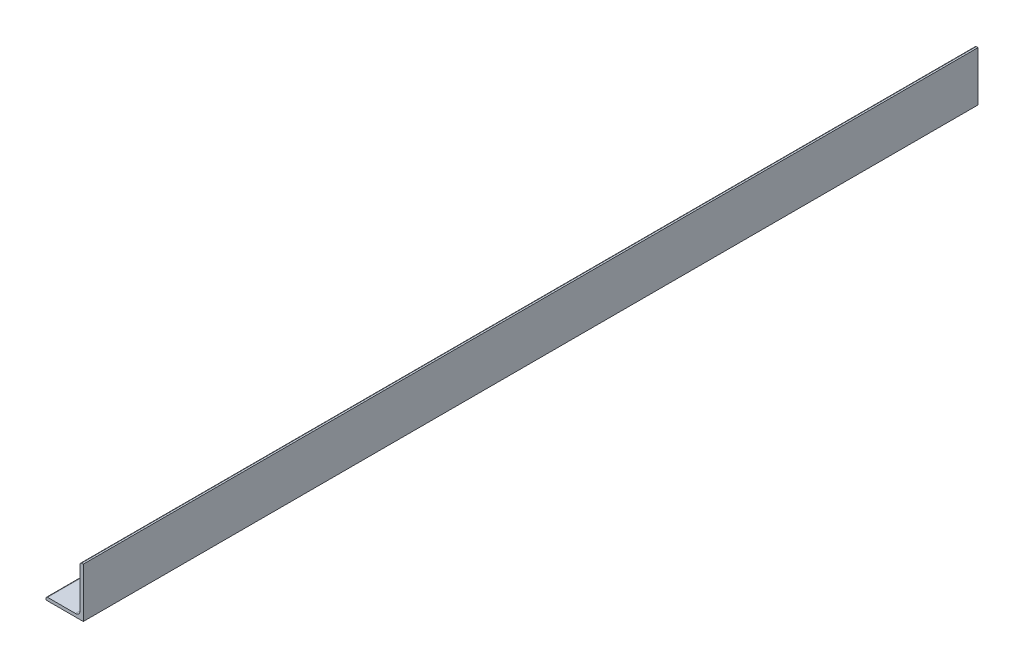
ISO-10303-21;
HEADER;
FILE_DESCRIPTION(('STEP AP214'),'2;1');
FILE_NAME('part.step','',(''),(''),'','','');
FILE_SCHEMA(('AUTOMOTIVE_DESIGN { 1 0 10303 214 1 1 1 1 }'));
ENDSEC;
DATA;
#1=APPLICATION_CONTEXT('core data for automotive mechanical design processes');
#2=APPLICATION_PROTOCOL_DEFINITION('international standard','automotive_design',2000,#1);
#3=PRODUCT_CONTEXT('',#1,'mechanical');
#4=PRODUCT('Part','Part','',(#3));
#5=PRODUCT_RELATED_PRODUCT_CATEGORY('part','',(#4));
#6=PRODUCT_DEFINITION_FORMATION('','',#4);
#7=PRODUCT_DEFINITION_CONTEXT('part definition',#1,'design');
#8=PRODUCT_DEFINITION('design','',#6,#7);
#9=PRODUCT_DEFINITION_SHAPE('','',#8);
#10=(LENGTH_UNIT() NAMED_UNIT(*) SI_UNIT(.MILLI.,.METRE.));
#11=(NAMED_UNIT(*) PLANE_ANGLE_UNIT() SI_UNIT($,.RADIAN.));
#12=(NAMED_UNIT(*) SI_UNIT($,.STERADIAN.) SOLID_ANGLE_UNIT());
#13=UNCERTAINTY_MEASURE_WITH_UNIT(LENGTH_MEASURE(1.E-05),#10,'distance_accuracy_value','');
#14=(GEOMETRIC_REPRESENTATION_CONTEXT(3) GLOBAL_UNCERTAINTY_ASSIGNED_CONTEXT((#13)) GLOBAL_UNIT_ASSIGNED_CONTEXT((#10,
#11,#12)) REPRESENTATION_CONTEXT('',''));
#15=CARTESIAN_POINT('',(0.,0.,0.));
#16=DIRECTION('',(0.,0.,1.));
#17=DIRECTION('',(1.,0.,0.));
#18=AXIS2_PLACEMENT_3D('',#15,#16,#17);
#19=CARTESIAN_POINT('',(-19.05,-23.8125,457.2));
#20=DIRECTION('',(1.,0.,0.));
#21=DIRECTION('',(0.,0.,-1.));
#22=AXIS2_PLACEMENT_3D('',#19,#20,#21);
#23=PLANE('',#22);
#24=DIRECTION('',(0.,-1.,0.));
#25=VECTOR('',#24,1.);
#26=CARTESIAN_POINT('',(-19.05,-23.8125,-457.2));
#27=LINE('',#26,#25);
#28=CARTESIAN_POINT('',(-19.05,-23.8125,-457.2));
#29=VERTEX_POINT('',#28);
#30=CARTESIAN_POINT('',(-19.05,-25.4,-457.2));
#31=VERTEX_POINT('',#30);
#32=EDGE_CURVE('E150',#29,#31,#27,.T.);
#33=ORIENTED_EDGE('',*,*,#32,.T.);
#34=DIRECTION('',(0.,0.,-1.));
#35=VECTOR('',#34,1.);
#36=CARTESIAN_POINT('',(-19.05,-25.4,457.2));
#37=LINE('',#36,#35);
#38=CARTESIAN_POINT('',(-19.05,-25.4,457.2));
#39=VERTEX_POINT('',#38);
#40=EDGE_CURVE('E11',#39,#31,#37,.T.);
#41=ORIENTED_EDGE('',*,*,#40,.F.);
#42=DIRECTION('',(0.,-1.,0.));
#43=VECTOR('',#42,1.);
#44=CARTESIAN_POINT('',(-19.05,-23.8125,457.2));
#45=LINE('',#44,#43);
#46=CARTESIAN_POINT('',(-19.05,-23.8125,457.2));
#47=VERTEX_POINT('',#46);
#48=EDGE_CURVE('E175',#47,#39,#45,.T.);
#49=ORIENTED_EDGE('',*,*,#48,.F.);
#50=DIRECTION('',(0.,0.,-1.));
#51=VECTOR('',#50,1.);
#52=CARTESIAN_POINT('',(-19.05,-23.8125,457.2));
#53=LINE('',#52,#51);
#54=EDGE_CURVE('E146',#47,#29,#53,.T.);
#55=ORIENTED_EDGE('',*,*,#54,.T.);
#56=EDGE_LOOP('',(#33,#41,#49,#55));
#57=FACE_BOUND('',#56,.T.);
#58=ADVANCED_FACE('F43',(#57),#23,.F.);
#59=CARTESIAN_POINT('',(-19.05,-25.4,457.2));
#60=DIRECTION('',(0.,1.,0.));
#61=DIRECTION('',(-1.,0.,0.));
#62=AXIS2_PLACEMENT_3D('',#59,#60,#61);
#63=PLANE('',#62);
#64=DIRECTION('',(1.,0.,0.));
#65=VECTOR('',#64,1.);
#66=CARTESIAN_POINT('',(-19.05,-25.4,-457.2));
#67=LINE('',#66,#65);
#68=CARTESIAN_POINT('',(19.05,-25.4,-457.2));
#69=VERTEX_POINT('',#68);
#70=EDGE_CURVE('E154',#31,#69,#67,.T.);
#71=ORIENTED_EDGE('',*,*,#70,.T.);
#72=DIRECTION('',(0.,0.,-1.));
#73=VECTOR('',#72,1.);
#74=CARTESIAN_POINT('',(19.05,-25.4,457.2));
#75=LINE('',#74,#73);
#76=CARTESIAN_POINT('',(19.05,-25.4,457.2));
#77=VERTEX_POINT('',#76);
#78=EDGE_CURVE('E52',#77,#69,#75,.T.);
#79=ORIENTED_EDGE('',*,*,#78,.F.);
#80=DIRECTION('',(1.,0.,0.));
#81=VECTOR('',#80,1.);
#82=CARTESIAN_POINT('',(-19.05,-25.4,457.2));
#83=LINE('',#82,#81);
#84=EDGE_CURVE('E106',#39,#77,#83,.T.);
#85=ORIENTED_EDGE('',*,*,#84,.F.);
#86=ORIENTED_EDGE('',*,*,#40,.T.);
#87=EDGE_LOOP('',(#71,#79,#85,#86));
#88=FACE_BOUND('',#87,.T.);
#89=ADVANCED_FACE('F231',(#88),#63,.F.);
#90=CARTESIAN_POINT('',(19.05,-25.4,457.2));
#91=DIRECTION('',(-1.,0.,0.));
#92=DIRECTION('',(0.,-1.,0.));
#93=AXIS2_PLACEMENT_3D('',#90,#91,#92);
#94=PLANE('',#93);
#95=DIRECTION('',(0.,1.,0.));
#96=VECTOR('',#95,1.);
#97=CARTESIAN_POINT('',(19.05,-25.4,-457.2));
#98=LINE('',#97,#96);
#99=CARTESIAN_POINT('',(19.05,25.4,-457.2));
#100=VERTEX_POINT('',#99);
#101=EDGE_CURVE('E157',#69,#100,#98,.T.);
#102=ORIENTED_EDGE('',*,*,#101,.T.);
#103=DIRECTION('',(0.,0.,-1.));
#104=VECTOR('',#103,1.);
#105=CARTESIAN_POINT('',(19.05,25.4,457.2));
#106=LINE('',#105,#104);
#107=CARTESIAN_POINT('',(19.05,25.4,457.2));
#108=VERTEX_POINT('',#107);
#109=EDGE_CURVE('E190',#108,#100,#106,.T.);
#110=ORIENTED_EDGE('',*,*,#109,.F.);
#111=DIRECTION('',(0.,1.,0.));
#112=VECTOR('',#111,1.);
#113=CARTESIAN_POINT('',(19.05,-25.4,457.2));
#114=LINE('',#113,#112);
#115=EDGE_CURVE('E200',#77,#108,#114,.T.);
#116=ORIENTED_EDGE('',*,*,#115,.F.);
#117=ORIENTED_EDGE('',*,*,#78,.T.);
#118=EDGE_LOOP('',(#102,#110,#116,#117));
#119=FACE_BOUND('',#118,.T.);
#120=ADVANCED_FACE('F198',(#119),#94,.F.);
#121=CARTESIAN_POINT('',(17.4625,25.4,457.2));
#122=DIRECTION('',(0.,-1.,0.));
#123=DIRECTION('',(1.,0.,0.));
#124=AXIS2_PLACEMENT_3D('',#121,#122,#123);
#125=PLANE('',#124);
#126=DIRECTION('',(-1.,0.,0.));
#127=VECTOR('',#126,1.);
#128=CARTESIAN_POINT('',(17.4625,25.4,-457.2));
#129=LINE('',#128,#127);
#130=CARTESIAN_POINT('',(17.4625,25.4,-457.2));
#131=VERTEX_POINT('',#130);
#132=EDGE_CURVE('E160',#100,#131,#129,.T.);
#133=ORIENTED_EDGE('',*,*,#132,.T.);
#134=DIRECTION('',(0.,0.,-1.));
#135=VECTOR('',#134,1.);
#136=CARTESIAN_POINT('',(17.4625,25.4,457.2));
#137=LINE('',#136,#135);
#138=CARTESIAN_POINT('',(17.4625,25.4,457.2));
#139=VERTEX_POINT('',#138);
#140=EDGE_CURVE('E186',#139,#131,#137,.T.);
#141=ORIENTED_EDGE('',*,*,#140,.F.);
#142=DIRECTION('',(-1.,0.,0.));
#143=VECTOR('',#142,1.);
#144=CARTESIAN_POINT('',(17.4625,25.4,457.2));
#145=LINE('',#144,#143);
#146=EDGE_CURVE('E217',#108,#139,#145,.T.);
#147=ORIENTED_EDGE('',*,*,#146,.F.);
#148=ORIENTED_EDGE('',*,*,#109,.T.);
#149=EDGE_LOOP('',(#133,#141,#147,#148));
#150=FACE_BOUND('',#149,.T.);
#151=ADVANCED_FACE('F209',(#150),#125,.F.);
#152=CARTESIAN_POINT('',(17.4625,23.8125,457.2));
#153=DIRECTION('',(0.,0.,-1.));
#154=DIRECTION('',(-1.,0.,0.));
#155=AXIS2_PLACEMENT_3D('',#152,#153,#154);
#156=CYLINDRICAL_SURFACE('',#155,1.5875);
#157=CARTESIAN_POINT('',(17.4625,23.8125,-457.2));
#158=DIRECTION('',(0.,0.,1.));
#159=DIRECTION('',(-1.,0.,0.));
#160=AXIS2_PLACEMENT_3D('',#157,#158,#159);
#161=CIRCLE('',#160,1.5875);
#162=CARTESIAN_POINT('',(15.875,23.8125,-457.2));
#163=VERTEX_POINT('',#162);
#164=EDGE_CURVE('E163',#131,#163,#161,.T.);
#165=ORIENTED_EDGE('',*,*,#164,.T.);
#166=DIRECTION('',(0.,0.,-1.));
#167=VECTOR('',#166,1.);
#168=CARTESIAN_POINT('',(15.875,23.8125,457.2));
#169=LINE('',#168,#167);
#170=CARTESIAN_POINT('',(15.875,23.8125,457.2));
#171=VERTEX_POINT('',#170);
#172=EDGE_CURVE('E182',#171,#163,#169,.T.);
#173=ORIENTED_EDGE('',*,*,#172,.F.);
#174=CARTESIAN_POINT('',(17.4625,23.8125,457.2));
#175=DIRECTION('',(0.,0.,1.));
#176=DIRECTION('',(-1.,0.,0.));
#177=AXIS2_PLACEMENT_3D('',#174,#175,#176);
#178=CIRCLE('',#177,1.5875);
#179=EDGE_CURVE('E215',#139,#171,#178,.T.);
#180=ORIENTED_EDGE('',*,*,#179,.F.);
#181=ORIENTED_EDGE('',*,*,#140,.T.);
#182=EDGE_LOOP('',(#165,#173,#180,#181));
#183=FACE_BOUND('',#182,.T.);
#184=ADVANCED_FACE('F213',(#183),#156,.T.);
#185=CARTESIAN_POINT('',(15.875,23.8125,457.2));
#186=DIRECTION('',(1.,0.,0.));
#187=DIRECTION('',(0.,1.,0.));
#188=AXIS2_PLACEMENT_3D('',#185,#186,#187);
#189=PLANE('',#188);
#190=DIRECTION('',(0.,-1.,0.));
#191=VECTOR('',#190,1.);
#192=CARTESIAN_POINT('',(15.875,23.8125,-457.2));
#193=LINE('',#192,#191);
#194=CARTESIAN_POINT('',(15.875,-17.4498,-457.2));
#195=VERTEX_POINT('',#194);
#196=EDGE_CURVE('E166',#163,#195,#193,.T.);
#197=ORIENTED_EDGE('',*,*,#196,.T.);
#198=DIRECTION('',(0.,0.,-1.));
#199=VECTOR('',#198,1.);
#200=CARTESIAN_POINT('',(15.875,-17.4498,457.2));
#201=LINE('',#200,#199);
#202=CARTESIAN_POINT('',(15.875,-17.4498,457.2));
#203=VERTEX_POINT('',#202);
#204=EDGE_CURVE('E139',#203,#195,#201,.T.);
#205=ORIENTED_EDGE('',*,*,#204,.F.);
#206=DIRECTION('',(0.,-1.,0.));
#207=VECTOR('',#206,1.);
#208=CARTESIAN_POINT('',(15.875,23.8125,457.2));
#209=LINE('',#208,#207);
#210=EDGE_CURVE('E128',#171,#203,#209,.T.);
#211=ORIENTED_EDGE('',*,*,#210,.F.);
#212=ORIENTED_EDGE('',*,*,#172,.T.);
#213=EDGE_LOOP('',(#197,#205,#211,#212));
#214=FACE_BOUND('',#213,.T.);
#215=ADVANCED_FACE('F243',(#214),#189,.F.);
#216=CARTESIAN_POINT('',(11.0998,-17.4498,457.2));
#217=DIRECTION('',(0.,0.,-1.));
#218=DIRECTION('',(-1.,0.,0.));
#219=AXIS2_PLACEMENT_3D('',#216,#217,#218);
#220=CYLINDRICAL_SURFACE('',#219,4.7752);
#221=CARTESIAN_POINT('',(11.0998,-17.4498,-457.2));
#222=DIRECTION('',(0.,0.,-1.));
#223=DIRECTION('',(-1.,0.,0.));
#224=AXIS2_PLACEMENT_3D('',#221,#222,#223);
#225=CIRCLE('',#224,4.7752);
#226=CARTESIAN_POINT('',(11.0998,-22.225,-457.2));
#227=VERTEX_POINT('',#226);
#228=EDGE_CURVE('E137',#195,#227,#225,.T.);
#229=ORIENTED_EDGE('',*,*,#228,.T.);
#230=DIRECTION('',(0.,0.,-1.));
#231=VECTOR('',#230,1.);
#232=CARTESIAN_POINT('',(11.0998,-22.225,457.2));
#233=LINE('',#232,#231);
#234=CARTESIAN_POINT('',(11.0998,-22.225,457.2));
#235=VERTEX_POINT('',#234);
#236=EDGE_CURVE('E134',#235,#227,#233,.T.);
#237=ORIENTED_EDGE('',*,*,#236,.F.);
#238=CARTESIAN_POINT('',(11.0998,-17.4498,457.2));
#239=DIRECTION('',(0.,0.,-1.));
#240=DIRECTION('',(-1.,0.,0.));
#241=AXIS2_PLACEMENT_3D('',#238,#239,#240);
#242=CIRCLE('',#241,4.7752);
#243=EDGE_CURVE('E122',#203,#235,#242,.T.);
#244=ORIENTED_EDGE('',*,*,#243,.F.);
#245=ORIENTED_EDGE('',*,*,#204,.T.);
#246=EDGE_LOOP('',(#229,#237,#244,#245));
#247=FACE_BOUND('',#246,.T.);
#248=ADVANCED_FACE('F135',(#247),#220,.F.);
#249=CARTESIAN_POINT('',(11.0998,-22.225,457.2));
#250=DIRECTION('',(0.,-1.,0.));
#251=DIRECTION('',(1.,0.,0.));
#252=AXIS2_PLACEMENT_3D('',#249,#250,#251);
#253=PLANE('',#252);
#254=DIRECTION('',(-1.,0.,0.));
#255=VECTOR('',#254,1.);
#256=CARTESIAN_POINT('',(11.0998,-22.225,-457.2));
#257=LINE('',#256,#255);
#258=CARTESIAN_POINT('',(-17.4625,-22.225,-457.2));
#259=VERTEX_POINT('',#258);
#260=EDGE_CURVE('E92',#227,#259,#257,.T.);
#261=ORIENTED_EDGE('',*,*,#260,.T.);
#262=DIRECTION('',(0.,0.,-1.));
#263=VECTOR('',#262,1.);
#264=CARTESIAN_POINT('',(-17.4625,-22.225,457.2));
#265=LINE('',#264,#263);
#266=CARTESIAN_POINT('',(-17.4625,-22.225,457.2));
#267=VERTEX_POINT('',#266);
#268=EDGE_CURVE('E140',#267,#259,#265,.T.);
#269=ORIENTED_EDGE('',*,*,#268,.F.);
#270=DIRECTION('',(-1.,0.,0.));
#271=VECTOR('',#270,1.);
#272=CARTESIAN_POINT('',(11.0998,-22.225,457.2));
#273=LINE('',#272,#271);
#274=EDGE_CURVE('E126',#235,#267,#273,.T.);
#275=ORIENTED_EDGE('',*,*,#274,.F.);
#276=ORIENTED_EDGE('',*,*,#236,.T.);
#277=EDGE_LOOP('',(#261,#269,#275,#276));
#278=FACE_BOUND('',#277,.T.);
#279=ADVANCED_FACE('F142',(#278),#253,.F.);
#280=CARTESIAN_POINT('',(-17.4625,-23.8125,457.2));
#281=DIRECTION('',(0.,0.,-1.));
#282=DIRECTION('',(-1.,0.,0.));
#283=AXIS2_PLACEMENT_3D('',#280,#281,#282);
#284=CYLINDRICAL_SURFACE('',#283,1.5875);
#285=CARTESIAN_POINT('',(-17.4625,-23.8125,-457.2));
#286=DIRECTION('',(0.,0.,1.));
#287=DIRECTION('',(-1.,0.,0.));
#288=AXIS2_PLACEMENT_3D('',#285,#286,#287);
#289=CIRCLE('',#288,1.5875);
#290=EDGE_CURVE('E98',#259,#29,#289,.T.);
#291=ORIENTED_EDGE('',*,*,#290,.T.);
#292=ORIENTED_EDGE('',*,*,#54,.F.);
#293=CARTESIAN_POINT('',(-17.4625,-23.8125,457.2));
#294=DIRECTION('',(0.,0.,1.));
#295=DIRECTION('',(-1.,0.,0.));
#296=AXIS2_PLACEMENT_3D('',#293,#294,#295);
#297=CIRCLE('',#296,1.5875);
#298=EDGE_CURVE('E60',#267,#47,#297,.T.);
#299=ORIENTED_EDGE('',*,*,#298,.F.);
#300=ORIENTED_EDGE('',*,*,#268,.T.);
#301=EDGE_LOOP('',(#291,#292,#299,#300));
#302=FACE_BOUND('',#301,.T.);
#303=ADVANCED_FACE('F251',(#302),#284,.T.);
#304=CARTESIAN_POINT('',(17.4625,23.8125,457.2));
#305=DIRECTION('',(0.,0.,-1.));
#306=DIRECTION('',(-1.,0.,0.));
#307=AXIS2_PLACEMENT_3D('',#304,#305,#306);
#308=PLANE('',#307);
#309=ORIENTED_EDGE('',*,*,#48,.T.);
#310=ORIENTED_EDGE('',*,*,#84,.T.);
#311=ORIENTED_EDGE('',*,*,#115,.T.);
#312=ORIENTED_EDGE('',*,*,#146,.T.);
#313=ORIENTED_EDGE('',*,*,#179,.T.);
#314=ORIENTED_EDGE('',*,*,#210,.T.);
#315=ORIENTED_EDGE('',*,*,#243,.T.);
#316=ORIENTED_EDGE('',*,*,#274,.T.);
#317=ORIENTED_EDGE('',*,*,#298,.T.);
#318=EDGE_LOOP('',(#309,#310,#311,#312,#313,#314,#315,#316,#317));
#319=FACE_BOUND('',#318,.T.);
#320=ADVANCED_FACE('F124',(#319),#308,.F.);
#321=CARTESIAN_POINT('',(17.4625,23.8125,-457.2));
#322=DIRECTION('',(0.,0.,-1.));
#323=DIRECTION('',(-1.,0.,0.));
#324=AXIS2_PLACEMENT_3D('',#321,#322,#323);
#325=PLANE('',#324);
#326=ORIENTED_EDGE('',*,*,#32,.F.);
#327=ORIENTED_EDGE('',*,*,#290,.F.);
#328=ORIENTED_EDGE('',*,*,#260,.F.);
#329=ORIENTED_EDGE('',*,*,#228,.F.);
#330=ORIENTED_EDGE('',*,*,#196,.F.);
#331=ORIENTED_EDGE('',*,*,#164,.F.);
#332=ORIENTED_EDGE('',*,*,#132,.F.);
#333=ORIENTED_EDGE('',*,*,#101,.F.);
#334=ORIENTED_EDGE('',*,*,#70,.F.);
#335=EDGE_LOOP('',(#326,#327,#328,#329,#330,#331,#332,#333,#334));
#336=FACE_BOUND('',#335,.T.);
#337=ADVANCED_FACE('F204',(#336),#325,.T.);
#338=CLOSED_SHELL('',(#58,#89,#120,#151,#184,#215,#248,#279,#303,#320,#337));
#339=MANIFOLD_SOLID_BREP('B2',#338);
#340=ADVANCED_BREP_SHAPE_REPRESENTATION('',(#18,#339),#14);
#341=SHAPE_DEFINITION_REPRESENTATION(#9,#340);
ENDSEC;
END-ISO-10303-21;
